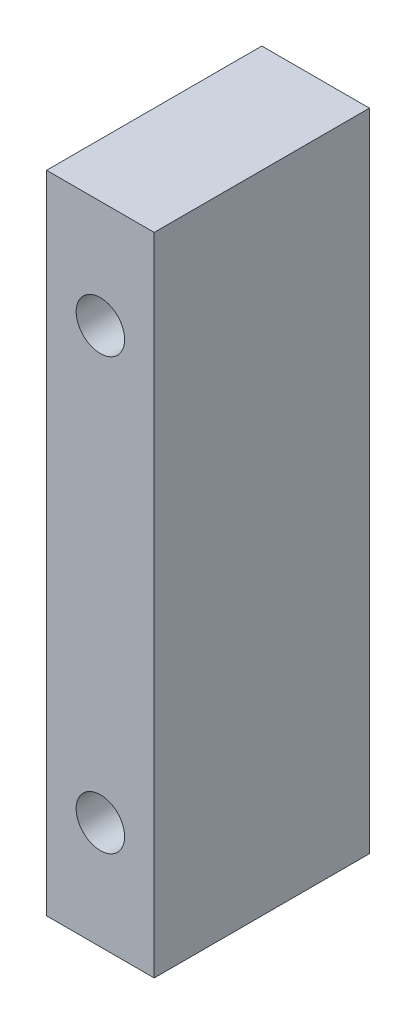
ISO-10303-21;
HEADER;
FILE_DESCRIPTION(('STEP AP214'),'2;1');
FILE_NAME('part.step','',(''),(''),'','','');
FILE_SCHEMA(('AUTOMOTIVE_DESIGN { 1 0 10303 214 1 1 1 1 }'));
ENDSEC;
DATA;
#1=APPLICATION_CONTEXT('core data for automotive mechanical design processes');
#2=APPLICATION_PROTOCOL_DEFINITION('international standard','automotive_design',2000,#1);
#3=PRODUCT_CONTEXT('',#1,'mechanical');
#4=PRODUCT('Part','Part','',(#3));
#5=PRODUCT_RELATED_PRODUCT_CATEGORY('part','',(#4));
#6=PRODUCT_DEFINITION_FORMATION('','',#4);
#7=PRODUCT_DEFINITION_CONTEXT('part definition',#1,'design');
#8=PRODUCT_DEFINITION('design','',#6,#7);
#9=PRODUCT_DEFINITION_SHAPE('','',#8);
#10=(LENGTH_UNIT() NAMED_UNIT(*) SI_UNIT(.MILLI.,.METRE.));
#11=(NAMED_UNIT(*) PLANE_ANGLE_UNIT() SI_UNIT($,.RADIAN.));
#12=(NAMED_UNIT(*) SI_UNIT($,.STERADIAN.) SOLID_ANGLE_UNIT());
#13=UNCERTAINTY_MEASURE_WITH_UNIT(LENGTH_MEASURE(1.E-05),#10,'distance_accuracy_value','');
#14=(GEOMETRIC_REPRESENTATION_CONTEXT(3) GLOBAL_UNCERTAINTY_ASSIGNED_CONTEXT((#13)) GLOBAL_UNIT_ASSIGNED_CONTEXT((#10,
#11,#12)) REPRESENTATION_CONTEXT('',''));
#15=CARTESIAN_POINT('',(0.,0.,0.));
#16=DIRECTION('',(0.,0.,1.));
#17=DIRECTION('',(1.,0.,0.));
#18=AXIS2_PLACEMENT_3D('',#15,#16,#17);
#19=CARTESIAN_POINT('',(0.,0.,40.));
#20=DIRECTION('',(0.,0.,-1.));
#21=DIRECTION('',(-1.,0.,0.));
#22=AXIS2_PLACEMENT_3D('',#19,#20,#21);
#23=PLANE('',#22);
#24=DIRECTION('',(0.,-1.,0.));
#25=VECTOR('',#24,1.);
#26=CARTESIAN_POINT('',(0.,0.,40.));
#27=LINE('',#26,#25);
#28=CARTESIAN_POINT('',(0.,120.,40.));
#29=VERTEX_POINT('',#28);
#30=CARTESIAN_POINT('',(0.,0.,40.));
#31=VERTEX_POINT('',#30);
#32=EDGE_CURVE('E98',#29,#31,#27,.T.);
#33=ORIENTED_EDGE('',*,*,#32,.T.);
#34=DIRECTION('',(1.,0.,0.));
#35=VECTOR('',#34,1.);
#36=CARTESIAN_POINT('',(0.,0.,40.));
#37=LINE('',#36,#35);
#38=CARTESIAN_POINT('',(20.,0.,40.));
#39=VERTEX_POINT('',#38);
#40=EDGE_CURVE('E93',#31,#39,#37,.T.);
#41=ORIENTED_EDGE('',*,*,#40,.T.);
#42=DIRECTION('',(0.,1.,0.));
#43=VECTOR('',#42,1.);
#44=CARTESIAN_POINT('',(20.,0.,40.));
#45=LINE('',#44,#43);
#46=CARTESIAN_POINT('',(20.,120.,40.));
#47=VERTEX_POINT('',#46);
#48=EDGE_CURVE('E96',#39,#47,#45,.T.);
#49=ORIENTED_EDGE('',*,*,#48,.T.);
#50=DIRECTION('',(-1.,0.,0.));
#51=VECTOR('',#50,1.);
#52=CARTESIAN_POINT('',(0.,120.,40.));
#53=LINE('',#52,#51);
#54=EDGE_CURVE('E63',#47,#29,#53,.T.);
#55=ORIENTED_EDGE('',*,*,#54,.T.);
#56=EDGE_LOOP('',(#33,#41,#49,#55));
#57=FACE_BOUND('',#56,.T.);
#58=CARTESIAN_POINT('',(10.,20.,40.));
#59=DIRECTION('',(0.,0.,1.));
#60=DIRECTION('',(1.,0.,0.));
#61=AXIS2_PLACEMENT_3D('',#58,#59,#60);
#62=CIRCLE('',#61,4.5);
#63=CARTESIAN_POINT('',(14.5,20.,40.));
#64=VERTEX_POINT('',#63);
#65=EDGE_CURVE('E119',#64,#64,#62,.T.);
#66=ORIENTED_EDGE('',*,*,#65,.F.);
#67=EDGE_LOOP('',(#66));
#68=FACE_BOUND('',#67,.T.);
#69=CARTESIAN_POINT('',(10.,100.,40.));
#70=DIRECTION('',(0.,0.,1.));
#71=DIRECTION('',(1.,0.,0.));
#72=AXIS2_PLACEMENT_3D('',#69,#70,#71);
#73=CIRCLE('',#72,4.5);
#74=CARTESIAN_POINT('',(14.5,100.,40.));
#75=VERTEX_POINT('',#74);
#76=EDGE_CURVE('E142',#75,#75,#73,.T.);
#77=ORIENTED_EDGE('',*,*,#76,.F.);
#78=EDGE_LOOP('',(#77));
#79=FACE_BOUND('',#78,.T.);
#80=ADVANCED_FACE('F45',(#57,#68,#79),#23,.F.);
#81=CARTESIAN_POINT('',(0.,0.,0.));
#82=DIRECTION('',(0.,0.,-1.));
#83=DIRECTION('',(-1.,0.,0.));
#84=AXIS2_PLACEMENT_3D('',#81,#82,#83);
#85=PLANE('',#84);
#86=CARTESIAN_POINT('',(10.,20.,0.));
#87=DIRECTION('',(0.,0.,1.));
#88=DIRECTION('',(1.,0.,0.));
#89=AXIS2_PLACEMENT_3D('',#86,#87,#88);
#90=CIRCLE('',#89,4.5);
#91=CARTESIAN_POINT('',(14.5,20.,0.));
#92=VERTEX_POINT('',#91);
#93=EDGE_CURVE('E138',#92,#92,#90,.T.);
#94=ORIENTED_EDGE('',*,*,#93,.T.);
#95=EDGE_LOOP('',(#94));
#96=FACE_BOUND('',#95,.T.);
#97=DIRECTION('',(0.,-1.,0.));
#98=VECTOR('',#97,1.);
#99=CARTESIAN_POINT('',(0.,0.,0.));
#100=LINE('',#99,#98);
#101=CARTESIAN_POINT('',(0.,120.,0.));
#102=VERTEX_POINT('',#101);
#103=CARTESIAN_POINT('',(0.,0.,0.));
#104=VERTEX_POINT('',#103);
#105=EDGE_CURVE('E115',#102,#104,#100,.T.);
#106=ORIENTED_EDGE('',*,*,#105,.F.);
#107=DIRECTION('',(-1.,0.,0.));
#108=VECTOR('',#107,1.);
#109=CARTESIAN_POINT('',(0.,120.,0.));
#110=LINE('',#109,#108);
#111=CARTESIAN_POINT('',(20.,120.,0.));
#112=VERTEX_POINT('',#111);
#113=EDGE_CURVE('E86',#112,#102,#110,.T.);
#114=ORIENTED_EDGE('',*,*,#113,.F.);
#115=DIRECTION('',(0.,1.,0.));
#116=VECTOR('',#115,1.);
#117=CARTESIAN_POINT('',(20.,0.,0.));
#118=LINE('',#117,#116);
#119=CARTESIAN_POINT('',(20.,0.,0.));
#120=VERTEX_POINT('',#119);
#121=EDGE_CURVE('E80',#120,#112,#118,.T.);
#122=ORIENTED_EDGE('',*,*,#121,.F.);
#123=DIRECTION('',(1.,0.,0.));
#124=VECTOR('',#123,1.);
#125=CARTESIAN_POINT('',(0.,0.,0.));
#126=LINE('',#125,#124);
#127=EDGE_CURVE('E103',#104,#120,#126,.T.);
#128=ORIENTED_EDGE('',*,*,#127,.F.);
#129=EDGE_LOOP('',(#106,#114,#122,#128));
#130=FACE_BOUND('',#129,.T.);
#131=CARTESIAN_POINT('',(10.,100.,0.));
#132=DIRECTION('',(0.,0.,1.));
#133=DIRECTION('',(1.,0.,0.));
#134=AXIS2_PLACEMENT_3D('',#131,#132,#133);
#135=CIRCLE('',#134,4.5);
#136=CARTESIAN_POINT('',(14.5,100.,0.));
#137=VERTEX_POINT('',#136);
#138=EDGE_CURVE('E145',#137,#137,#135,.T.);
#139=ORIENTED_EDGE('',*,*,#138,.T.);
#140=EDGE_LOOP('',(#139));
#141=FACE_BOUND('',#140,.T.);
#142=ADVANCED_FACE('F132',(#96,#130,#141),#85,.T.);
#143=CARTESIAN_POINT('',(0.,0.,40.));
#144=DIRECTION('',(1.,0.,0.));
#145=DIRECTION('',(0.,0.,-1.));
#146=AXIS2_PLACEMENT_3D('',#143,#144,#145);
#147=PLANE('',#146);
#148=ORIENTED_EDGE('',*,*,#105,.T.);
#149=DIRECTION('',(0.,0.,-1.));
#150=VECTOR('',#149,1.);
#151=CARTESIAN_POINT('',(0.,0.,40.));
#152=LINE('',#151,#150);
#153=EDGE_CURVE('E11',#31,#104,#152,.T.);
#154=ORIENTED_EDGE('',*,*,#153,.F.);
#155=ORIENTED_EDGE('',*,*,#32,.F.);
#156=DIRECTION('',(0.,0.,-1.));
#157=VECTOR('',#156,1.);
#158=CARTESIAN_POINT('',(0.,120.,40.));
#159=LINE('',#158,#157);
#160=EDGE_CURVE('E111',#29,#102,#159,.T.);
#161=ORIENTED_EDGE('',*,*,#160,.T.);
#162=EDGE_LOOP('',(#148,#154,#155,#161));
#163=FACE_BOUND('',#162,.T.);
#164=ADVANCED_FACE('F47',(#163),#147,.F.);
#165=CARTESIAN_POINT('',(0.,0.,40.));
#166=DIRECTION('',(0.,1.,0.));
#167=DIRECTION('',(0.,0.,1.));
#168=AXIS2_PLACEMENT_3D('',#165,#166,#167);
#169=PLANE('',#168);
#170=ORIENTED_EDGE('',*,*,#127,.T.);
#171=DIRECTION('',(0.,0.,-1.));
#172=VECTOR('',#171,1.);
#173=CARTESIAN_POINT('',(20.,0.,40.));
#174=LINE('',#173,#172);
#175=EDGE_CURVE('E55',#39,#120,#174,.T.);
#176=ORIENTED_EDGE('',*,*,#175,.F.);
#177=ORIENTED_EDGE('',*,*,#40,.F.);
#178=ORIENTED_EDGE('',*,*,#153,.T.);
#179=EDGE_LOOP('',(#170,#176,#177,#178));
#180=FACE_BOUND('',#179,.T.);
#181=ADVANCED_FACE('F102',(#180),#169,.F.);
#182=CARTESIAN_POINT('',(20.,0.,40.));
#183=DIRECTION('',(-1.,0.,0.));
#184=DIRECTION('',(0.,0.,1.));
#185=AXIS2_PLACEMENT_3D('',#182,#183,#184);
#186=PLANE('',#185);
#187=ORIENTED_EDGE('',*,*,#121,.T.);
#188=DIRECTION('',(0.,0.,-1.));
#189=VECTOR('',#188,1.);
#190=CARTESIAN_POINT('',(20.,120.,40.));
#191=LINE('',#190,#189);
#192=EDGE_CURVE('E105',#47,#112,#191,.T.);
#193=ORIENTED_EDGE('',*,*,#192,.F.);
#194=ORIENTED_EDGE('',*,*,#48,.F.);
#195=ORIENTED_EDGE('',*,*,#175,.T.);
#196=EDGE_LOOP('',(#187,#193,#194,#195));
#197=FACE_BOUND('',#196,.T.);
#198=ADVANCED_FACE('F106',(#197),#186,.F.);
#199=CARTESIAN_POINT('',(0.,120.,40.));
#200=DIRECTION('',(0.,-1.,0.));
#201=DIRECTION('',(0.,0.,-1.));
#202=AXIS2_PLACEMENT_3D('',#199,#200,#201);
#203=PLANE('',#202);
#204=ORIENTED_EDGE('',*,*,#113,.T.);
#205=ORIENTED_EDGE('',*,*,#160,.F.);
#206=ORIENTED_EDGE('',*,*,#54,.F.);
#207=ORIENTED_EDGE('',*,*,#192,.T.);
#208=EDGE_LOOP('',(#204,#205,#206,#207));
#209=FACE_BOUND('',#208,.T.);
#210=ADVANCED_FACE('F129',(#209),#203,.F.);
#211=CARTESIAN_POINT('',(10.,20.,40.));
#212=DIRECTION('',(0.,0.,-1.));
#213=DIRECTION('',(-1.,0.,0.));
#214=AXIS2_PLACEMENT_3D('',#211,#212,#213);
#215=CYLINDRICAL_SURFACE('',#214,4.5);
#216=ORIENTED_EDGE('',*,*,#65,.T.);
#217=EDGE_LOOP('',(#216));
#218=FACE_BOUND('',#217,.T.);
#219=ORIENTED_EDGE('',*,*,#93,.F.);
#220=EDGE_LOOP('',(#219));
#221=FACE_BOUND('',#220,.T.);
#222=ADVANCED_FACE('F162',(#218,#221),#215,.F.);
#223=CARTESIAN_POINT('',(10.,100.,40.));
#224=DIRECTION('',(0.,0.,-1.));
#225=DIRECTION('',(-1.,0.,0.));
#226=AXIS2_PLACEMENT_3D('',#223,#224,#225);
#227=CYLINDRICAL_SURFACE('',#226,4.5);
#228=ORIENTED_EDGE('',*,*,#76,.T.);
#229=EDGE_LOOP('',(#228));
#230=FACE_BOUND('',#229,.T.);
#231=ORIENTED_EDGE('',*,*,#138,.F.);
#232=EDGE_LOOP('',(#231));
#233=FACE_BOUND('',#232,.T.);
#234=ADVANCED_FACE('F152',(#230,#233),#227,.F.);
#235=CLOSED_SHELL('',(#80,#142,#164,#181,#198,#210,#222,#234));
#236=MANIFOLD_SOLID_BREP('B2',#235);
#237=ADVANCED_BREP_SHAPE_REPRESENTATION('',(#18,#236),#14);
#238=SHAPE_DEFINITION_REPRESENTATION(#9,#237);
ENDSEC;
END-ISO-10303-21;
